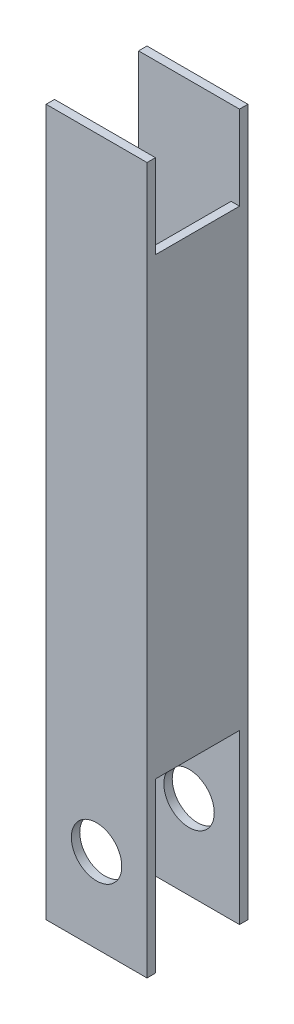
ISO-10303-21;
HEADER;
FILE_DESCRIPTION(('STEP AP214'),'2;1');
FILE_NAME('part.step','',(''),(''),'','','');
FILE_SCHEMA(('AUTOMOTIVE_DESIGN { 1 0 10303 214 1 1 1 1 }'));
ENDSEC;
DATA;
#1=APPLICATION_CONTEXT('core data for automotive mechanical design processes');
#2=APPLICATION_PROTOCOL_DEFINITION('international standard','automotive_design',2000,#1);
#3=PRODUCT_CONTEXT('',#1,'mechanical');
#4=PRODUCT('Part','Part','',(#3));
#5=PRODUCT_RELATED_PRODUCT_CATEGORY('part','',(#4));
#6=PRODUCT_DEFINITION_FORMATION('','',#4);
#7=PRODUCT_DEFINITION_CONTEXT('part definition',#1,'design');
#8=PRODUCT_DEFINITION('design','',#6,#7);
#9=PRODUCT_DEFINITION_SHAPE('','',#8);
#10=(LENGTH_UNIT() NAMED_UNIT(*) SI_UNIT(.MILLI.,.METRE.));
#11=(NAMED_UNIT(*) PLANE_ANGLE_UNIT() SI_UNIT($,.RADIAN.));
#12=(NAMED_UNIT(*) SI_UNIT($,.STERADIAN.) SOLID_ANGLE_UNIT());
#13=UNCERTAINTY_MEASURE_WITH_UNIT(LENGTH_MEASURE(1.E-05),#10,'distance_accuracy_value','');
#14=(GEOMETRIC_REPRESENTATION_CONTEXT(3) GLOBAL_UNCERTAINTY_ASSIGNED_CONTEXT((#13)) GLOBAL_UNIT_ASSIGNED_CONTEXT((#10,
#11,#12)) REPRESENTATION_CONTEXT('',''));
#15=CARTESIAN_POINT('',(0.,0.,0.));
#16=DIRECTION('',(0.,0.,1.));
#17=DIRECTION('',(1.,0.,0.));
#18=AXIS2_PLACEMENT_3D('',#15,#16,#17);
#19=CARTESIAN_POINT('',(0.,420.,0.));
#20=DIRECTION('',(0.,1.,0.));
#21=DIRECTION('',(0.,0.,1.));
#22=AXIS2_PLACEMENT_3D('',#19,#20,#21);
#23=PLANE('',#22);
#24=DIRECTION('',(1.,0.,0.));
#25=VECTOR('',#24,1.);
#26=CARTESIAN_POINT('',(30.,420.,25.));
#27=LINE('',#26,#25);
#28=CARTESIAN_POINT('',(-30.,420.,25.));
#29=VERTEX_POINT('',#28);
#30=CARTESIAN_POINT('',(30.,420.,25.));
#31=VERTEX_POINT('',#30);
#32=EDGE_CURVE('E170',#29,#31,#27,.T.);
#33=ORIENTED_EDGE('',*,*,#32,.F.);
#34=DIRECTION('',(0.,0.,1.));
#35=VECTOR('',#34,1.);
#36=CARTESIAN_POINT('',(-30.,420.,30.));
#37=LINE('',#36,#35);
#38=CARTESIAN_POINT('',(-30.,420.,30.));
#39=VERTEX_POINT('',#38);
#40=EDGE_CURVE('E201',#29,#39,#37,.T.);
#41=ORIENTED_EDGE('',*,*,#40,.T.);
#42=DIRECTION('',(1.,0.,0.));
#43=VECTOR('',#42,1.);
#44=CARTESIAN_POINT('',(30.,420.,30.));
#45=LINE('',#44,#43);
#46=CARTESIAN_POINT('',(30.,420.,30.));
#47=VERTEX_POINT('',#46);
#48=EDGE_CURVE('E288',#39,#47,#45,.T.);
#49=ORIENTED_EDGE('',*,*,#48,.T.);
#50=DIRECTION('',(0.,0.,-1.));
#51=VECTOR('',#50,1.);
#52=CARTESIAN_POINT('',(30.,420.,30.));
#53=LINE('',#52,#51);
#54=EDGE_CURVE('E215',#47,#31,#53,.T.);
#55=ORIENTED_EDGE('',*,*,#54,.T.);
#56=EDGE_LOOP('',(#33,#41,#49,#55));
#57=FACE_BOUND('',#56,.T.);
#58=ADVANCED_FACE('F47',(#57),#23,.T.);
#59=CARTESIAN_POINT('',(0.,0.,0.));
#60=DIRECTION('',(0.,1.,0.));
#61=DIRECTION('',(0.,0.,1.));
#62=AXIS2_PLACEMENT_3D('',#59,#60,#61);
#63=PLANE('',#62);
#64=DIRECTION('',(0.,0.,1.));
#65=VECTOR('',#64,1.);
#66=CARTESIAN_POINT('',(-30.,0.,30.));
#67=LINE('',#66,#65);
#68=CARTESIAN_POINT('',(-30.,0.,25.));
#69=VERTEX_POINT('',#68);
#70=CARTESIAN_POINT('',(-30.,0.,30.));
#71=VERTEX_POINT('',#70);
#72=EDGE_CURVE('E188',#69,#71,#67,.T.);
#73=ORIENTED_EDGE('',*,*,#72,.F.);
#74=DIRECTION('',(1.,0.,0.));
#75=VECTOR('',#74,1.);
#76=CARTESIAN_POINT('',(30.,0.,25.));
#77=LINE('',#76,#75);
#78=CARTESIAN_POINT('',(30.,0.,25.));
#79=VERTEX_POINT('',#78);
#80=EDGE_CURVE('E171',#69,#79,#77,.T.);
#81=ORIENTED_EDGE('',*,*,#80,.T.);
#82=DIRECTION('',(0.,0.,-1.));
#83=VECTOR('',#82,1.);
#84=CARTESIAN_POINT('',(30.,0.,30.));
#85=LINE('',#84,#83);
#86=CARTESIAN_POINT('',(30.,0.,30.));
#87=VERTEX_POINT('',#86);
#88=EDGE_CURVE('E196',#87,#79,#85,.T.);
#89=ORIENTED_EDGE('',*,*,#88,.F.);
#90=DIRECTION('',(1.,0.,0.));
#91=VECTOR('',#90,1.);
#92=CARTESIAN_POINT('',(30.,0.,30.));
#93=LINE('',#92,#91);
#94=EDGE_CURVE('E187',#71,#87,#93,.T.);
#95=ORIENTED_EDGE('',*,*,#94,.F.);
#96=EDGE_LOOP('',(#73,#81,#89,#95));
#97=FACE_BOUND('',#96,.T.);
#98=ADVANCED_FACE('F221',(#97),#63,.F.);
#99=CARTESIAN_POINT('',(-30.,420.,30.));
#100=DIRECTION('',(1.,0.,0.));
#101=DIRECTION('',(0.,0.,-1.));
#102=AXIS2_PLACEMENT_3D('',#99,#100,#101);
#103=PLANE('',#102);
#104=DIRECTION('',(0.,0.,1.));
#105=VECTOR('',#104,1.);
#106=CARTESIAN_POINT('',(-30.,100.,25.));
#107=LINE('',#106,#105);
#108=CARTESIAN_POINT('',(-30.,100.,-25.));
#109=VERTEX_POINT('',#108);
#110=CARTESIAN_POINT('',(-30.,100.,25.));
#111=VERTEX_POINT('',#110);
#112=EDGE_CURVE('E180',#109,#111,#107,.T.);
#113=ORIENTED_EDGE('',*,*,#112,.T.);
#114=DIRECTION('',(0.,-1.,0.));
#115=VECTOR('',#114,1.);
#116=CARTESIAN_POINT('',(-30.,0.,25.));
#117=LINE('',#116,#115);
#118=EDGE_CURVE('E311',#111,#69,#117,.T.);
#119=ORIENTED_EDGE('',*,*,#118,.T.);
#120=ORIENTED_EDGE('',*,*,#72,.T.);
#121=DIRECTION('',(0.,-1.,0.));
#122=VECTOR('',#121,1.);
#123=CARTESIAN_POINT('',(-30.,420.,30.));
#124=LINE('',#123,#122);
#125=EDGE_CURVE('E11',#39,#71,#124,.T.);
#126=ORIENTED_EDGE('',*,*,#125,.F.);
#127=ORIENTED_EDGE('',*,*,#40,.F.);
#128=DIRECTION('',(0.,-1.,0.));
#129=VECTOR('',#128,1.);
#130=CARTESIAN_POINT('',(-30.,370.,25.));
#131=LINE('',#130,#129);
#132=CARTESIAN_POINT('',(-30.,370.,25.));
#133=VERTEX_POINT('',#132);
#134=EDGE_CURVE('E245',#29,#133,#131,.T.);
#135=ORIENTED_EDGE('',*,*,#134,.T.);
#136=DIRECTION('',(0.,0.,-1.));
#137=VECTOR('',#136,1.);
#138=CARTESIAN_POINT('',(-30.,370.,25.));
#139=LINE('',#138,#137);
#140=CARTESIAN_POINT('',(-30.,370.,-25.));
#141=VERTEX_POINT('',#140);
#142=EDGE_CURVE('E254',#133,#141,#139,.T.);
#143=ORIENTED_EDGE('',*,*,#142,.T.);
#144=DIRECTION('',(0.,1.,0.));
#145=VECTOR('',#144,1.);
#146=CARTESIAN_POINT('',(-30.,370.,-25.));
#147=LINE('',#146,#145);
#148=CARTESIAN_POINT('',(-30.,420.,-25.));
#149=VERTEX_POINT('',#148);
#150=EDGE_CURVE('E262',#141,#149,#147,.T.);
#151=ORIENTED_EDGE('',*,*,#150,.T.);
#152=CARTESIAN_POINT('',(-30.,420.,-30.));
#153=VERTEX_POINT('',#152);
#154=EDGE_CURVE('E285',#153,#149,#37,.T.);
#155=ORIENTED_EDGE('',*,*,#154,.F.);
#156=DIRECTION('',(0.,-1.,0.));
#157=VECTOR('',#156,1.);
#158=CARTESIAN_POINT('',(-30.,420.,-30.));
#159=LINE('',#158,#157);
#160=CARTESIAN_POINT('',(-30.,0.,-30.));
#161=VERTEX_POINT('',#160);
#162=EDGE_CURVE('E186',#153,#161,#159,.T.);
#163=ORIENTED_EDGE('',*,*,#162,.T.);
#164=CARTESIAN_POINT('',(-30.,0.,-25.));
#165=VERTEX_POINT('',#164);
#166=EDGE_CURVE('E167',#161,#165,#67,.T.);
#167=ORIENTED_EDGE('',*,*,#166,.T.);
#168=DIRECTION('',(0.,1.,0.));
#169=VECTOR('',#168,1.);
#170=CARTESIAN_POINT('',(-30.,0.,-25.));
#171=LINE('',#170,#169);
#172=EDGE_CURVE('E174',#165,#109,#171,.T.);
#173=ORIENTED_EDGE('',*,*,#172,.T.);
#174=EDGE_LOOP('',(#113,#119,#120,#126,#127,#135,#143,#151,#155,#163,#167,#173));
#175=FACE_BOUND('',#174,.T.);
#176=ADVANCED_FACE('F49',(#175),#103,.F.);
#177=CARTESIAN_POINT('',(30.,420.,30.));
#178=DIRECTION('',(0.,0.,-1.));
#179=DIRECTION('',(-1.,0.,0.));
#180=AXIS2_PLACEMENT_3D('',#177,#178,#179);
#181=PLANE('',#180);
#182=CARTESIAN_POINT('',(0.,50.,30.));
#183=DIRECTION('',(0.,0.,-1.));
#184=DIRECTION('',(-1.,0.,0.));
#185=AXIS2_PLACEMENT_3D('',#182,#183,#184);
#186=CIRCLE('',#185,15.);
#187=CARTESIAN_POINT('',(-15.,50.,30.));
#188=VERTEX_POINT('',#187);
#189=EDGE_CURVE('E353',#188,#188,#186,.T.);
#190=ORIENTED_EDGE('',*,*,#189,.T.);
#191=EDGE_LOOP('',(#190));
#192=FACE_BOUND('',#191,.T.);
#193=ORIENTED_EDGE('',*,*,#94,.T.);
#194=DIRECTION('',(0.,-1.,0.));
#195=VECTOR('',#194,1.);
#196=CARTESIAN_POINT('',(30.,420.,30.));
#197=LINE('',#196,#195);
#198=EDGE_CURVE('E56',#47,#87,#197,.T.);
#199=ORIENTED_EDGE('',*,*,#198,.F.);
#200=ORIENTED_EDGE('',*,*,#48,.F.);
#201=ORIENTED_EDGE('',*,*,#125,.T.);
#202=EDGE_LOOP('',(#193,#199,#200,#201));
#203=FACE_BOUND('',#202,.T.);
#204=ADVANCED_FACE('F310',(#192,#203),#181,.F.);
#205=CARTESIAN_POINT('',(30.,420.,30.));
#206=DIRECTION('',(-1.,0.,0.));
#207=DIRECTION('',(0.,0.,1.));
#208=AXIS2_PLACEMENT_3D('',#205,#206,#207);
#209=PLANE('',#208);
#210=ORIENTED_EDGE('',*,*,#88,.T.);
#211=DIRECTION('',(0.,-1.,0.));
#212=VECTOR('',#211,1.);
#213=CARTESIAN_POINT('',(30.,0.,25.));
#214=LINE('',#213,#212);
#215=CARTESIAN_POINT('',(30.,100.,25.));
#216=VERTEX_POINT('',#215);
#217=EDGE_CURVE('E181',#216,#79,#214,.T.);
#218=ORIENTED_EDGE('',*,*,#217,.F.);
#219=DIRECTION('',(0.,0.,1.));
#220=VECTOR('',#219,1.);
#221=CARTESIAN_POINT('',(30.,100.,25.));
#222=LINE('',#221,#220);
#223=CARTESIAN_POINT('',(30.,100.,-25.));
#224=VERTEX_POINT('',#223);
#225=EDGE_CURVE('E233',#224,#216,#222,.T.);
#226=ORIENTED_EDGE('',*,*,#225,.F.);
#227=DIRECTION('',(0.,1.,0.));
#228=VECTOR('',#227,1.);
#229=CARTESIAN_POINT('',(30.,0.,-25.));
#230=LINE('',#229,#228);
#231=CARTESIAN_POINT('',(30.,0.,-25.));
#232=VERTEX_POINT('',#231);
#233=EDGE_CURVE('E235',#232,#224,#230,.T.);
#234=ORIENTED_EDGE('',*,*,#233,.F.);
#235=CARTESIAN_POINT('',(30.,0.,-30.));
#236=VERTEX_POINT('',#235);
#237=EDGE_CURVE('E168',#232,#236,#85,.T.);
#238=ORIENTED_EDGE('',*,*,#237,.T.);
#239=DIRECTION('',(0.,-1.,0.));
#240=VECTOR('',#239,1.);
#241=CARTESIAN_POINT('',(30.,420.,-30.));
#242=LINE('',#241,#240);
#243=CARTESIAN_POINT('',(30.,420.,-30.));
#244=VERTEX_POINT('',#243);
#245=EDGE_CURVE('E203',#244,#236,#242,.T.);
#246=ORIENTED_EDGE('',*,*,#245,.F.);
#247=CARTESIAN_POINT('',(30.,420.,-25.));
#248=VERTEX_POINT('',#247);
#249=EDGE_CURVE('E289',#248,#244,#53,.T.);
#250=ORIENTED_EDGE('',*,*,#249,.F.);
#251=DIRECTION('',(0.,1.,0.));
#252=VECTOR('',#251,1.);
#253=CARTESIAN_POINT('',(30.,370.,-25.));
#254=LINE('',#253,#252);
#255=CARTESIAN_POINT('',(30.,370.,-25.));
#256=VERTEX_POINT('',#255);
#257=EDGE_CURVE('E253',#256,#248,#254,.T.);
#258=ORIENTED_EDGE('',*,*,#257,.F.);
#259=DIRECTION('',(0.,0.,-1.));
#260=VECTOR('',#259,1.);
#261=CARTESIAN_POINT('',(30.,370.,25.));
#262=LINE('',#261,#260);
#263=CARTESIAN_POINT('',(30.,370.,25.));
#264=VERTEX_POINT('',#263);
#265=EDGE_CURVE('E257',#264,#256,#262,.T.);
#266=ORIENTED_EDGE('',*,*,#265,.F.);
#267=DIRECTION('',(0.,-1.,0.));
#268=VECTOR('',#267,1.);
#269=CARTESIAN_POINT('',(30.,370.,25.));
#270=LINE('',#269,#268);
#271=EDGE_CURVE('E250',#31,#264,#270,.T.);
#272=ORIENTED_EDGE('',*,*,#271,.F.);
#273=ORIENTED_EDGE('',*,*,#54,.F.);
#274=ORIENTED_EDGE('',*,*,#198,.T.);
#275=EDGE_LOOP('',(#210,#218,#226,#234,#238,#246,#250,#258,#266,#272,#273,#274));
#276=FACE_BOUND('',#275,.T.);
#277=ADVANCED_FACE('F211',(#276),#209,.F.);
#278=CARTESIAN_POINT('',(30.,420.,-30.));
#279=DIRECTION('',(0.,0.,1.));
#280=DIRECTION('',(1.,0.,0.));
#281=AXIS2_PLACEMENT_3D('',#278,#279,#280);
#282=PLANE('',#281);
#283=CARTESIAN_POINT('',(0.,50.,-30.));
#284=DIRECTION('',(0.,0.,-1.));
#285=DIRECTION('',(-1.,0.,0.));
#286=AXIS2_PLACEMENT_3D('',#283,#284,#285);
#287=CIRCLE('',#286,15.);
#288=CARTESIAN_POINT('',(-15.,50.,-30.));
#289=VERTEX_POINT('',#288);
#290=EDGE_CURVE('E355',#289,#289,#287,.T.);
#291=ORIENTED_EDGE('',*,*,#290,.F.);
#292=EDGE_LOOP('',(#291));
#293=FACE_BOUND('',#292,.T.);
#294=DIRECTION('',(-1.,0.,0.));
#295=VECTOR('',#294,1.);
#296=CARTESIAN_POINT('',(30.,0.,-30.));
#297=LINE('',#296,#295);
#298=EDGE_CURVE('E199',#236,#161,#297,.T.);
#299=ORIENTED_EDGE('',*,*,#298,.T.);
#300=ORIENTED_EDGE('',*,*,#162,.F.);
#301=DIRECTION('',(-1.,0.,0.));
#302=VECTOR('',#301,1.);
#303=CARTESIAN_POINT('',(30.,420.,-30.));
#304=LINE('',#303,#302);
#305=EDGE_CURVE('E193',#244,#153,#304,.T.);
#306=ORIENTED_EDGE('',*,*,#305,.F.);
#307=ORIENTED_EDGE('',*,*,#245,.T.);
#308=EDGE_LOOP('',(#299,#300,#306,#307));
#309=FACE_BOUND('',#308,.T.);
#310=ADVANCED_FACE('F298',(#293,#309),#282,.F.);
#311=DIRECTION('',(-1.,0.,0.));
#312=VECTOR('',#311,1.);
#313=CARTESIAN_POINT('',(30.,420.,-25.));
#314=LINE('',#313,#312);
#315=EDGE_CURVE('E279',#248,#149,#314,.T.);
#316=ORIENTED_EDGE('',*,*,#315,.F.);
#317=ORIENTED_EDGE('',*,*,#249,.T.);
#318=ORIENTED_EDGE('',*,*,#305,.T.);
#319=ORIENTED_EDGE('',*,*,#154,.T.);
#320=EDGE_LOOP('',(#316,#317,#318,#319));
#321=FACE_BOUND('',#320,.T.);
#322=ADVANCED_FACE('F294',(#321),#23,.T.);
#323=ORIENTED_EDGE('',*,*,#237,.F.);
#324=DIRECTION('',(-1.,0.,0.));
#325=VECTOR('',#324,1.);
#326=CARTESIAN_POINT('',(30.,0.,-25.));
#327=LINE('',#326,#325);
#328=EDGE_CURVE('E162',#232,#165,#327,.T.);
#329=ORIENTED_EDGE('',*,*,#328,.T.);
#330=ORIENTED_EDGE('',*,*,#166,.F.);
#331=ORIENTED_EDGE('',*,*,#298,.F.);
#332=EDGE_LOOP('',(#323,#329,#330,#331));
#333=FACE_BOUND('',#332,.T.);
#334=ADVANCED_FACE('F164',(#333),#63,.F.);
#335=CARTESIAN_POINT('',(-25.,420.,30.));
#336=DIRECTION('',(1.,0.,0.));
#337=DIRECTION('',(0.,0.,-1.));
#338=AXIS2_PLACEMENT_3D('',#335,#336,#337);
#339=PLANE('',#338);
#340=DIRECTION('',(0.,0.,1.));
#341=VECTOR('',#340,1.);
#342=CARTESIAN_POINT('',(-25.,100.,30.));
#343=LINE('',#342,#341);
#344=CARTESIAN_POINT('',(-25.,100.,-25.));
#345=VERTEX_POINT('',#344);
#346=CARTESIAN_POINT('',(-25.,100.,25.));
#347=VERTEX_POINT('',#346);
#348=EDGE_CURVE('E226',#345,#347,#343,.T.);
#349=ORIENTED_EDGE('',*,*,#348,.F.);
#350=DIRECTION('',(0.,-1.,0.));
#351=VECTOR('',#350,1.);
#352=CARTESIAN_POINT('',(-25.,420.,-25.));
#353=LINE('',#352,#351);
#354=CARTESIAN_POINT('',(-25.,370.,-25.));
#355=VERTEX_POINT('',#354);
#356=EDGE_CURVE('E276',#355,#345,#353,.T.);
#357=ORIENTED_EDGE('',*,*,#356,.F.);
#358=DIRECTION('',(0.,0.,-1.));
#359=VECTOR('',#358,1.);
#360=CARTESIAN_POINT('',(-25.,370.,30.));
#361=LINE('',#360,#359);
#362=CARTESIAN_POINT('',(-25.,370.,25.));
#363=VERTEX_POINT('',#362);
#364=EDGE_CURVE('E268',#363,#355,#361,.T.);
#365=ORIENTED_EDGE('',*,*,#364,.F.);
#366=DIRECTION('',(0.,-1.,0.));
#367=VECTOR('',#366,1.);
#368=CARTESIAN_POINT('',(-25.,420.,25.));
#369=LINE('',#368,#367);
#370=EDGE_CURVE('E191',#363,#347,#369,.T.);
#371=ORIENTED_EDGE('',*,*,#370,.T.);
#372=EDGE_LOOP('',(#349,#357,#365,#371));
#373=FACE_BOUND('',#372,.T.);
#374=ADVANCED_FACE('F329',(#373),#339,.T.);
#375=CARTESIAN_POINT('',(30.,420.,25.));
#376=DIRECTION('',(0.,0.,-1.));
#377=DIRECTION('',(-1.,0.,0.));
#378=AXIS2_PLACEMENT_3D('',#375,#376,#377);
#379=PLANE('',#378);
#380=CARTESIAN_POINT('',(0.,50.,25.));
#381=DIRECTION('',(0.,0.,-1.));
#382=DIRECTION('',(-1.,0.,0.));
#383=AXIS2_PLACEMENT_3D('',#380,#381,#382);
#384=CIRCLE('',#383,15.);
#385=CARTESIAN_POINT('',(-15.,50.,25.));
#386=VERTEX_POINT('',#385);
#387=EDGE_CURVE('E306',#386,#386,#384,.T.);
#388=ORIENTED_EDGE('',*,*,#387,.F.);
#389=EDGE_LOOP('',(#388));
#390=FACE_BOUND('',#389,.T.);
#391=DIRECTION('',(0.,-1.,0.));
#392=VECTOR('',#391,1.);
#393=CARTESIAN_POINT('',(25.,420.,25.));
#394=LINE('',#393,#392);
#395=CARTESIAN_POINT('',(25.,370.,25.));
#396=VERTEX_POINT('',#395);
#397=CARTESIAN_POINT('',(25.,100.,25.));
#398=VERTEX_POINT('',#397);
#399=EDGE_CURVE('E275',#396,#398,#394,.T.);
#400=ORIENTED_EDGE('',*,*,#399,.T.);
#401=DIRECTION('',(1.,0.,0.));
#402=VECTOR('',#401,1.);
#403=CARTESIAN_POINT('',(-30.,100.,25.));
#404=LINE('',#403,#402);
#405=EDGE_CURVE('E230',#398,#216,#404,.T.);
#406=ORIENTED_EDGE('',*,*,#405,.T.);
#407=ORIENTED_EDGE('',*,*,#217,.T.);
#408=ORIENTED_EDGE('',*,*,#80,.F.);
#409=ORIENTED_EDGE('',*,*,#118,.F.);
#410=EDGE_CURVE('E239',#111,#347,#404,.T.);
#411=ORIENTED_EDGE('',*,*,#410,.T.);
#412=ORIENTED_EDGE('',*,*,#370,.F.);
#413=DIRECTION('',(1.,0.,0.));
#414=VECTOR('',#413,1.);
#415=CARTESIAN_POINT('',(-30.,370.,25.));
#416=LINE('',#415,#414);
#417=EDGE_CURVE('E247',#133,#363,#416,.T.);
#418=ORIENTED_EDGE('',*,*,#417,.F.);
#419=ORIENTED_EDGE('',*,*,#134,.F.);
#420=ORIENTED_EDGE('',*,*,#32,.T.);
#421=ORIENTED_EDGE('',*,*,#271,.T.);
#422=EDGE_CURVE('E249',#396,#264,#416,.T.);
#423=ORIENTED_EDGE('',*,*,#422,.F.);
#424=EDGE_LOOP('',(#400,#406,#407,#408,#409,#411,#412,#418,#419,#420,#421,#423));
#425=FACE_BOUND('',#424,.T.);
#426=ADVANCED_FACE('F229',(#390,#425),#379,.T.);
#427=CARTESIAN_POINT('',(25.,420.,30.));
#428=DIRECTION('',(-1.,0.,0.));
#429=DIRECTION('',(0.,0.,1.));
#430=AXIS2_PLACEMENT_3D('',#427,#428,#429);
#431=PLANE('',#430);
#432=DIRECTION('',(0.,0.,-1.));
#433=VECTOR('',#432,1.);
#434=CARTESIAN_POINT('',(25.,100.,30.));
#435=LINE('',#434,#433);
#436=CARTESIAN_POINT('',(25.,100.,-25.));
#437=VERTEX_POINT('',#436);
#438=EDGE_CURVE('E270',#398,#437,#435,.T.);
#439=ORIENTED_EDGE('',*,*,#438,.F.);
#440=ORIENTED_EDGE('',*,*,#399,.F.);
#441=DIRECTION('',(0.,0.,1.));
#442=VECTOR('',#441,1.);
#443=CARTESIAN_POINT('',(25.,370.,30.));
#444=LINE('',#443,#442);
#445=CARTESIAN_POINT('',(25.,370.,-25.));
#446=VERTEX_POINT('',#445);
#447=EDGE_CURVE('E242',#446,#396,#444,.T.);
#448=ORIENTED_EDGE('',*,*,#447,.F.);
#449=DIRECTION('',(0.,-1.,0.));
#450=VECTOR('',#449,1.);
#451=CARTESIAN_POINT('',(25.,420.,-25.));
#452=LINE('',#451,#450);
#453=EDGE_CURVE('E278',#446,#437,#452,.T.);
#454=ORIENTED_EDGE('',*,*,#453,.T.);
#455=EDGE_LOOP('',(#439,#440,#448,#454));
#456=FACE_BOUND('',#455,.T.);
#457=ADVANCED_FACE('F318',(#456),#431,.T.);
#458=CARTESIAN_POINT('',(30.,420.,-25.));
#459=DIRECTION('',(0.,0.,1.));
#460=DIRECTION('',(1.,0.,0.));
#461=AXIS2_PLACEMENT_3D('',#458,#459,#460);
#462=PLANE('',#461);
#463=CARTESIAN_POINT('',(0.,50.,-25.));
#464=DIRECTION('',(0.,0.,1.));
#465=DIRECTION('',(1.,0.,0.));
#466=AXIS2_PLACEMENT_3D('',#463,#464,#465);
#467=CIRCLE('',#466,15.);
#468=CARTESIAN_POINT('',(15.,50.,-25.));
#469=VERTEX_POINT('',#468);
#470=EDGE_CURVE('E51',#469,#469,#467,.T.);
#471=ORIENTED_EDGE('',*,*,#470,.F.);
#472=EDGE_LOOP('',(#471));
#473=FACE_BOUND('',#472,.T.);
#474=ORIENTED_EDGE('',*,*,#356,.T.);
#475=DIRECTION('',(1.,0.,0.));
#476=VECTOR('',#475,1.);
#477=CARTESIAN_POINT('',(-30.,100.,-25.));
#478=LINE('',#477,#476);
#479=EDGE_CURVE('E176',#109,#345,#478,.T.);
#480=ORIENTED_EDGE('',*,*,#479,.F.);
#481=ORIENTED_EDGE('',*,*,#172,.F.);
#482=ORIENTED_EDGE('',*,*,#328,.F.);
#483=ORIENTED_EDGE('',*,*,#233,.T.);
#484=EDGE_CURVE('E70',#437,#224,#478,.T.);
#485=ORIENTED_EDGE('',*,*,#484,.F.);
#486=ORIENTED_EDGE('',*,*,#453,.F.);
#487=DIRECTION('',(1.,0.,0.));
#488=VECTOR('',#487,1.);
#489=CARTESIAN_POINT('',(-30.,370.,-25.));
#490=LINE('',#489,#488);
#491=EDGE_CURVE('E246',#446,#256,#490,.T.);
#492=ORIENTED_EDGE('',*,*,#491,.T.);
#493=ORIENTED_EDGE('',*,*,#257,.T.);
#494=ORIENTED_EDGE('',*,*,#315,.T.);
#495=ORIENTED_EDGE('',*,*,#150,.F.);
#496=EDGE_CURVE('E63',#141,#355,#490,.T.);
#497=ORIENTED_EDGE('',*,*,#496,.T.);
#498=EDGE_LOOP('',(#474,#480,#481,#482,#483,#485,#486,#492,#493,#494,#495,#497));
#499=FACE_BOUND('',#498,.T.);
#500=ADVANCED_FACE('F175',(#473,#499),#462,.T.);
#501=CARTESIAN_POINT('',(-30.,370.,25.));
#502=DIRECTION('',(0.,-1.,0.));
#503=DIRECTION('',(0.,0.,-1.));
#504=AXIS2_PLACEMENT_3D('',#501,#502,#503);
#505=PLANE('',#504);
#506=ORIENTED_EDGE('',*,*,#447,.T.);
#507=ORIENTED_EDGE('',*,*,#422,.T.);
#508=ORIENTED_EDGE('',*,*,#265,.T.);
#509=ORIENTED_EDGE('',*,*,#491,.F.);
#510=EDGE_LOOP('',(#506,#507,#508,#509));
#511=FACE_BOUND('',#510,.T.);
#512=ADVANCED_FACE('F302',(#511),#505,.F.);
#513=CARTESIAN_POINT('',(-30.,100.,25.));
#514=DIRECTION('',(0.,1.,0.));
#515=DIRECTION('',(0.,0.,1.));
#516=AXIS2_PLACEMENT_3D('',#513,#514,#515);
#517=PLANE('',#516);
#518=ORIENTED_EDGE('',*,*,#438,.T.);
#519=ORIENTED_EDGE('',*,*,#484,.T.);
#520=ORIENTED_EDGE('',*,*,#225,.T.);
#521=ORIENTED_EDGE('',*,*,#405,.F.);
#522=EDGE_LOOP('',(#518,#519,#520,#521));
#523=FACE_BOUND('',#522,.T.);
#524=ADVANCED_FACE('F315',(#523),#517,.F.);
#525=ORIENTED_EDGE('',*,*,#364,.T.);
#526=ORIENTED_EDGE('',*,*,#496,.F.);
#527=ORIENTED_EDGE('',*,*,#142,.F.);
#528=ORIENTED_EDGE('',*,*,#417,.T.);
#529=EDGE_LOOP('',(#525,#526,#527,#528));
#530=FACE_BOUND('',#529,.T.);
#531=ADVANCED_FACE('F376',(#530),#505,.F.);
#532=ORIENTED_EDGE('',*,*,#348,.T.);
#533=ORIENTED_EDGE('',*,*,#410,.F.);
#534=ORIENTED_EDGE('',*,*,#112,.F.);
#535=ORIENTED_EDGE('',*,*,#479,.T.);
#536=EDGE_LOOP('',(#532,#533,#534,#535));
#537=FACE_BOUND('',#536,.T.);
#538=ADVANCED_FACE('F371',(#537),#517,.F.);
#539=CARTESIAN_POINT('',(0.,50.,30.));
#540=DIRECTION('',(0.,0.,-1.));
#541=DIRECTION('',(-1.,0.,0.));
#542=AXIS2_PLACEMENT_3D('',#539,#540,#541);
#543=CYLINDRICAL_SURFACE('',#542,15.);
#544=ORIENTED_EDGE('',*,*,#470,.T.);
#545=EDGE_LOOP('',(#544));
#546=FACE_BOUND('',#545,.T.);
#547=ORIENTED_EDGE('',*,*,#290,.T.);
#548=EDGE_LOOP('',(#547));
#549=FACE_BOUND('',#548,.T.);
#550=ADVANCED_FACE('F366',(#546,#549),#543,.F.);
#551=ORIENTED_EDGE('',*,*,#387,.T.);
#552=EDGE_LOOP('',(#551));
#553=FACE_BOUND('',#552,.T.);
#554=ORIENTED_EDGE('',*,*,#189,.F.);
#555=EDGE_LOOP('',(#554));
#556=FACE_BOUND('',#555,.T.);
#557=ADVANCED_FACE('F364',(#553,#556),#543,.F.);
#558=CLOSED_SHELL('',(#58,#98,#176,#204,#277,#310,#322,#334,#374,#426,#457,#500,#512,#524,#531,
#538,#550,#557));
#559=MANIFOLD_SOLID_BREP('B2',#558);
#560=ADVANCED_BREP_SHAPE_REPRESENTATION('',(#18,#559),#14);
#561=SHAPE_DEFINITION_REPRESENTATION(#9,#560);
ENDSEC;
END-ISO-10303-21;
